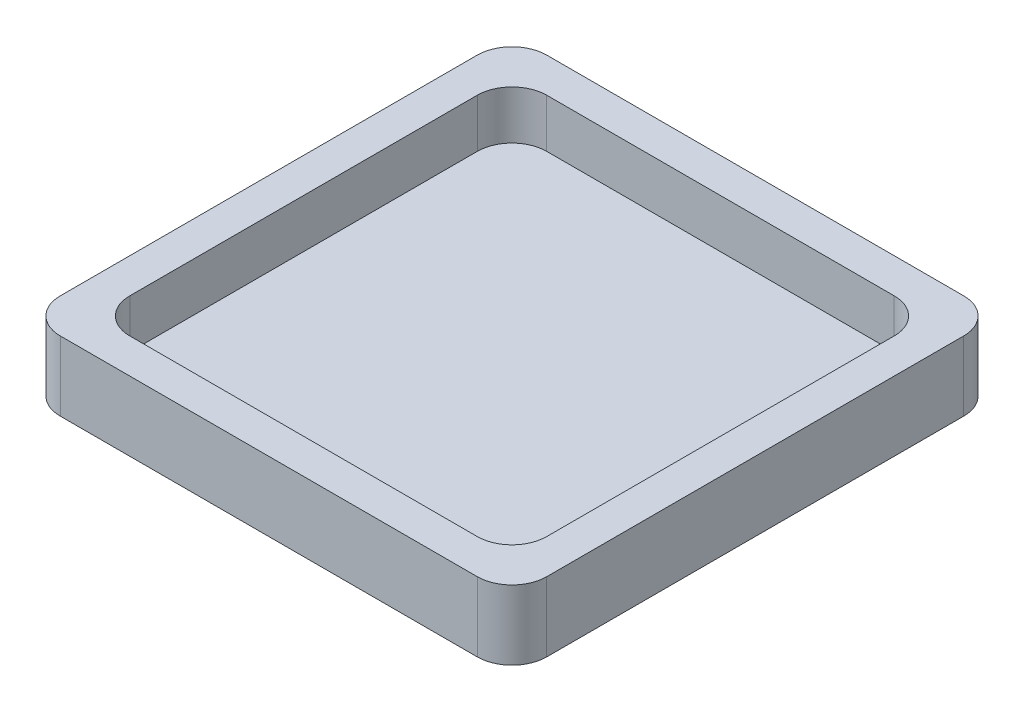
ISO-10303-21;
HEADER;
FILE_DESCRIPTION(('STEP AP214'),'2;1');
FILE_NAME('part.step','',(''),(''),'','','');
FILE_SCHEMA(('AUTOMOTIVE_DESIGN { 1 0 10303 214 1 1 1 1 }'));
ENDSEC;
DATA;
#1=APPLICATION_CONTEXT('core data for automotive mechanical design processes');
#2=APPLICATION_PROTOCOL_DEFINITION('international standard','automotive_design',2000,#1);
#3=PRODUCT_CONTEXT('',#1,'mechanical');
#4=PRODUCT('Part','Part','',(#3));
#5=PRODUCT_RELATED_PRODUCT_CATEGORY('part','',(#4));
#6=PRODUCT_DEFINITION_FORMATION('','',#4);
#7=PRODUCT_DEFINITION_CONTEXT('part definition',#1,'design');
#8=PRODUCT_DEFINITION('design','',#6,#7);
#9=PRODUCT_DEFINITION_SHAPE('','',#8);
#10=(LENGTH_UNIT() NAMED_UNIT(*) SI_UNIT(.MILLI.,.METRE.));
#11=(NAMED_UNIT(*) PLANE_ANGLE_UNIT() SI_UNIT($,.RADIAN.));
#12=(NAMED_UNIT(*) SI_UNIT($,.STERADIAN.) SOLID_ANGLE_UNIT());
#13=UNCERTAINTY_MEASURE_WITH_UNIT(LENGTH_MEASURE(1.E-05),#10,'distance_accuracy_value','');
#14=(GEOMETRIC_REPRESENTATION_CONTEXT(3) GLOBAL_UNCERTAINTY_ASSIGNED_CONTEXT((#13)) GLOBAL_UNIT_ASSIGNED_CONTEXT((#10,
#11,#12)) REPRESENTATION_CONTEXT('',''));
#15=CARTESIAN_POINT('',(0.,0.,0.));
#16=DIRECTION('',(0.,0.,1.));
#17=DIRECTION('',(1.,0.,0.));
#18=AXIS2_PLACEMENT_3D('',#15,#16,#17);
#19=CARTESIAN_POINT('',(44.45,12.7,-44.45));
#20=DIRECTION('',(-1.,0.,0.));
#21=DIRECTION('',(0.,0.,1.));
#22=AXIS2_PLACEMENT_3D('',#19,#20,#21);
#23=PLANE('',#22);
#24=DIRECTION('',(0.,0.,-1.));
#25=VECTOR('',#24,1.);
#26=CARTESIAN_POINT('',(44.45,0.,-44.45));
#27=LINE('',#26,#25);
#28=CARTESIAN_POINT('',(44.45,0.,38.1));
#29=VERTEX_POINT('',#28);
#30=CARTESIAN_POINT('',(44.45,0.,-38.1));
#31=VERTEX_POINT('',#30);
#32=EDGE_CURVE('E169',#29,#31,#27,.T.);
#33=ORIENTED_EDGE('',*,*,#32,.T.);
#34=DIRECTION('',(0.,-1.,0.));
#35=VECTOR('',#34,1.);
#36=CARTESIAN_POINT('',(44.45,12.7,-38.1));
#37=LINE('',#36,#35);
#38=CARTESIAN_POINT('',(44.45,12.7,-38.1));
#39=VERTEX_POINT('',#38);
#40=EDGE_CURVE('E204',#31,#39,#37,.F.);
#41=ORIENTED_EDGE('',*,*,#40,.T.);
#42=DIRECTION('',(0.,0.,-1.));
#43=VECTOR('',#42,1.);
#44=CARTESIAN_POINT('',(44.45,12.7,-44.45));
#45=LINE('',#44,#43);
#46=CARTESIAN_POINT('',(44.45,12.7,38.1));
#47=VERTEX_POINT('',#46);
#48=EDGE_CURVE('E167',#47,#39,#45,.T.);
#49=ORIENTED_EDGE('',*,*,#48,.F.);
#50=DIRECTION('',(0.,-1.,0.));
#51=VECTOR('',#50,1.);
#52=CARTESIAN_POINT('',(44.45,12.7,38.1));
#53=LINE('',#52,#51);
#54=EDGE_CURVE('E200',#47,#29,#53,.T.);
#55=ORIENTED_EDGE('',*,*,#54,.T.);
#56=EDGE_LOOP('',(#33,#41,#49,#55));
#57=FACE_BOUND('',#56,.T.);
#58=ADVANCED_FACE('F16',(#57),#23,.F.);
#59=CARTESIAN_POINT('',(-44.45,12.7,-44.45));
#60=DIRECTION('',(0.,0.,1.));
#61=DIRECTION('',(1.,0.,0.));
#62=AXIS2_PLACEMENT_3D('',#59,#60,#61);
#63=PLANE('',#62);
#64=DIRECTION('',(-1.,0.,0.));
#65=VECTOR('',#64,1.);
#66=CARTESIAN_POINT('',(-44.45,0.,-44.45));
#67=LINE('',#66,#65);
#68=CARTESIAN_POINT('',(38.1,0.,-44.45));
#69=VERTEX_POINT('',#68);
#70=CARTESIAN_POINT('',(-38.1,0.,-44.45));
#71=VERTEX_POINT('',#70);
#72=EDGE_CURVE('E161',#69,#71,#67,.T.);
#73=ORIENTED_EDGE('',*,*,#72,.T.);
#74=DIRECTION('',(0.,-1.,0.));
#75=VECTOR('',#74,1.);
#76=CARTESIAN_POINT('',(-38.1,12.7,-44.45));
#77=LINE('',#76,#75);
#78=CARTESIAN_POINT('',(-38.1,12.7,-44.45));
#79=VERTEX_POINT('',#78);
#80=EDGE_CURVE('E136',#71,#79,#77,.F.);
#81=ORIENTED_EDGE('',*,*,#80,.T.);
#82=DIRECTION('',(-1.,0.,0.));
#83=VECTOR('',#82,1.);
#84=CARTESIAN_POINT('',(-44.45,12.7,-44.45));
#85=LINE('',#84,#83);
#86=CARTESIAN_POINT('',(38.1,12.7,-44.45));
#87=VERTEX_POINT('',#86);
#88=EDGE_CURVE('E305',#87,#79,#85,.T.);
#89=ORIENTED_EDGE('',*,*,#88,.F.);
#90=DIRECTION('',(0.,-1.,0.));
#91=VECTOR('',#90,1.);
#92=CARTESIAN_POINT('',(38.1,12.7,-44.45));
#93=LINE('',#92,#91);
#94=EDGE_CURVE('E142',#87,#69,#93,.T.);
#95=ORIENTED_EDGE('',*,*,#94,.T.);
#96=EDGE_LOOP('',(#73,#81,#89,#95));
#97=FACE_BOUND('',#96,.T.);
#98=ADVANCED_FACE('F326',(#97),#63,.F.);
#99=CARTESIAN_POINT('',(-44.45,12.7,-44.45));
#100=DIRECTION('',(1.,0.,0.));
#101=DIRECTION('',(0.,0.,-1.));
#102=AXIS2_PLACEMENT_3D('',#99,#100,#101);
#103=PLANE('',#102);
#104=DIRECTION('',(0.,0.,1.));
#105=VECTOR('',#104,1.);
#106=CARTESIAN_POINT('',(-44.45,12.7,-44.45));
#107=LINE('',#106,#105);
#108=CARTESIAN_POINT('',(-44.45,12.7,-38.1));
#109=VERTEX_POINT('',#108);
#110=CARTESIAN_POINT('',(-44.45,12.7,38.1));
#111=VERTEX_POINT('',#110);
#112=EDGE_CURVE('E152',#109,#111,#107,.T.);
#113=ORIENTED_EDGE('',*,*,#112,.F.);
#114=DIRECTION('',(0.,-1.,0.));
#115=VECTOR('',#114,1.);
#116=CARTESIAN_POINT('',(-44.45,12.7,-38.1));
#117=LINE('',#116,#115);
#118=CARTESIAN_POINT('',(-44.45,0.,-38.1));
#119=VERTEX_POINT('',#118);
#120=EDGE_CURVE('E135',#109,#119,#117,.T.);
#121=ORIENTED_EDGE('',*,*,#120,.T.);
#122=DIRECTION('',(0.,0.,1.));
#123=VECTOR('',#122,1.);
#124=CARTESIAN_POINT('',(-44.45,0.,-44.45));
#125=LINE('',#124,#123);
#126=CARTESIAN_POINT('',(-44.45,0.,38.1));
#127=VERTEX_POINT('',#126);
#128=EDGE_CURVE('E149',#119,#127,#125,.T.);
#129=ORIENTED_EDGE('',*,*,#128,.T.);
#130=DIRECTION('',(0.,-1.,0.));
#131=VECTOR('',#130,1.);
#132=CARTESIAN_POINT('',(-44.45,12.7,38.1));
#133=LINE('',#132,#131);
#134=EDGE_CURVE('E155',#127,#111,#133,.F.);
#135=ORIENTED_EDGE('',*,*,#134,.T.);
#136=EDGE_LOOP('',(#113,#121,#129,#135));
#137=FACE_BOUND('',#136,.T.);
#138=ADVANCED_FACE('F148',(#137),#103,.F.);
#139=CARTESIAN_POINT('',(-44.45,12.7,44.45));
#140=DIRECTION('',(0.,0.,-1.));
#141=DIRECTION('',(-1.,0.,0.));
#142=AXIS2_PLACEMENT_3D('',#139,#140,#141);
#143=PLANE('',#142);
#144=DIRECTION('',(1.,0.,0.));
#145=VECTOR('',#144,1.);
#146=CARTESIAN_POINT('',(-44.45,0.,44.45));
#147=LINE('',#146,#145);
#148=CARTESIAN_POINT('',(-38.1,0.,44.45));
#149=VERTEX_POINT('',#148);
#150=CARTESIAN_POINT('',(38.1,0.,44.45));
#151=VERTEX_POINT('',#150);
#152=EDGE_CURVE('E160',#149,#151,#147,.T.);
#153=ORIENTED_EDGE('',*,*,#152,.T.);
#154=DIRECTION('',(0.,-1.,0.));
#155=VECTOR('',#154,1.);
#156=CARTESIAN_POINT('',(38.1,12.7,44.45));
#157=LINE('',#156,#155);
#158=CARTESIAN_POINT('',(38.1,12.7,44.45));
#159=VERTEX_POINT('',#158);
#160=EDGE_CURVE('E211',#151,#159,#157,.F.);
#161=ORIENTED_EDGE('',*,*,#160,.T.);
#162=DIRECTION('',(1.,0.,0.));
#163=VECTOR('',#162,1.);
#164=CARTESIAN_POINT('',(-44.45,12.7,44.45));
#165=LINE('',#164,#163);
#166=CARTESIAN_POINT('',(-38.1,12.7,44.45));
#167=VERTEX_POINT('',#166);
#168=EDGE_CURVE('E174',#167,#159,#165,.T.);
#169=ORIENTED_EDGE('',*,*,#168,.F.);
#170=DIRECTION('',(0.,-1.,0.));
#171=VECTOR('',#170,1.);
#172=CARTESIAN_POINT('',(-38.1,12.7,44.45));
#173=LINE('',#172,#171);
#174=EDGE_CURVE('E207',#167,#149,#173,.T.);
#175=ORIENTED_EDGE('',*,*,#174,.T.);
#176=EDGE_LOOP('',(#153,#161,#169,#175));
#177=FACE_BOUND('',#176,.T.);
#178=ADVANCED_FACE('F335',(#177),#143,.F.);
#179=CARTESIAN_POINT('',(0.,12.7,0.));
#180=DIRECTION('',(0.,1.,0.));
#181=DIRECTION('',(0.,0.,1.));
#182=AXIS2_PLACEMENT_3D('',#179,#180,#181);
#183=PLANE('',#182);
#184=DIRECTION('',(0.,0.,-1.));
#185=VECTOR('',#184,1.);
#186=CARTESIAN_POINT('',(38.1,12.7,-38.1));
#187=LINE('',#186,#185);
#188=CARTESIAN_POINT('',(38.1,12.7,31.75));
#189=VERTEX_POINT('',#188);
#190=CARTESIAN_POINT('',(38.1,12.7,-31.75));
#191=VERTEX_POINT('',#190);
#192=EDGE_CURVE('E275',#189,#191,#187,.T.);
#193=ORIENTED_EDGE('',*,*,#192,.F.);
#194=CARTESIAN_POINT('',(31.75,12.7,31.75));
#195=DIRECTION('',(0.,1.,0.));
#196=DIRECTION('',(0.,0.,1.));
#197=AXIS2_PLACEMENT_3D('',#194,#195,#196);
#198=CIRCLE('',#197,6.35);
#199=CARTESIAN_POINT('',(31.75,12.7,38.1));
#200=VERTEX_POINT('',#199);
#201=EDGE_CURVE('E252',#189,#200,#198,.F.);
#202=ORIENTED_EDGE('',*,*,#201,.T.);
#203=DIRECTION('',(1.,0.,0.));
#204=VECTOR('',#203,1.);
#205=CARTESIAN_POINT('',(-38.1,12.7,38.1));
#206=LINE('',#205,#204);
#207=CARTESIAN_POINT('',(-31.75,12.7,38.1));
#208=VERTEX_POINT('',#207);
#209=EDGE_CURVE('E298',#208,#200,#206,.T.);
#210=ORIENTED_EDGE('',*,*,#209,.F.);
#211=CARTESIAN_POINT('',(-31.75,12.7,31.75));
#212=DIRECTION('',(0.,1.,0.));
#213=DIRECTION('',(0.,0.,1.));
#214=AXIS2_PLACEMENT_3D('',#211,#212,#213);
#215=CIRCLE('',#214,6.35);
#216=CARTESIAN_POINT('',(-38.1,12.7,31.75));
#217=VERTEX_POINT('',#216);
#218=EDGE_CURVE('E10',#208,#217,#215,.F.);
#219=ORIENTED_EDGE('',*,*,#218,.T.);
#220=DIRECTION('',(0.,0.,1.));
#221=VECTOR('',#220,1.);
#222=CARTESIAN_POINT('',(-38.1,12.7,-38.1));
#223=LINE('',#222,#221);
#224=CARTESIAN_POINT('',(-38.1,12.7,-31.75));
#225=VERTEX_POINT('',#224);
#226=EDGE_CURVE('E266',#225,#217,#223,.T.);
#227=ORIENTED_EDGE('',*,*,#226,.F.);
#228=CARTESIAN_POINT('',(-31.75,12.7,-31.75));
#229=DIRECTION('',(0.,1.,0.));
#230=DIRECTION('',(0.,0.,1.));
#231=AXIS2_PLACEMENT_3D('',#228,#229,#230);
#232=CIRCLE('',#231,6.35);
#233=CARTESIAN_POINT('',(-31.75,12.7,-38.1));
#234=VERTEX_POINT('',#233);
#235=EDGE_CURVE('E25',#225,#234,#232,.F.);
#236=ORIENTED_EDGE('',*,*,#235,.T.);
#237=DIRECTION('',(-1.,0.,0.));
#238=VECTOR('',#237,1.);
#239=CARTESIAN_POINT('',(-38.1,12.7,-38.1));
#240=LINE('',#239,#238);
#241=CARTESIAN_POINT('',(31.75,12.7,-38.1));
#242=VERTEX_POINT('',#241);
#243=EDGE_CURVE('E265',#242,#234,#240,.T.);
#244=ORIENTED_EDGE('',*,*,#243,.F.);
#245=CARTESIAN_POINT('',(31.75,12.7,-31.75));
#246=DIRECTION('',(0.,1.,0.));
#247=DIRECTION('',(0.,0.,1.));
#248=AXIS2_PLACEMENT_3D('',#245,#246,#247);
#249=CIRCLE('',#248,6.35);
#250=EDGE_CURVE('E255',#242,#191,#249,.F.);
#251=ORIENTED_EDGE('',*,*,#250,.T.);
#252=EDGE_LOOP('',(#193,#202,#210,#219,#227,#236,#244,#251));
#253=FACE_BOUND('',#252,.T.);
#254=ORIENTED_EDGE('',*,*,#88,.T.);
#255=CARTESIAN_POINT('',(-38.1,12.7,-38.1));
#256=DIRECTION('',(0.,1.,0.));
#257=DIRECTION('',(0.,0.,1.));
#258=AXIS2_PLACEMENT_3D('',#255,#256,#257);
#259=CIRCLE('',#258,6.35);
#260=EDGE_CURVE('E197',#79,#109,#259,.T.);
#261=ORIENTED_EDGE('',*,*,#260,.T.);
#262=ORIENTED_EDGE('',*,*,#112,.T.);
#263=CARTESIAN_POINT('',(-38.1,12.7,38.1));
#264=DIRECTION('',(0.,1.,0.));
#265=DIRECTION('',(0.,0.,1.));
#266=AXIS2_PLACEMENT_3D('',#263,#264,#265);
#267=CIRCLE('',#266,6.35);
#268=EDGE_CURVE('E188',#111,#167,#267,.T.);
#269=ORIENTED_EDGE('',*,*,#268,.T.);
#270=ORIENTED_EDGE('',*,*,#168,.T.);
#271=CARTESIAN_POINT('',(38.1,12.7,38.1));
#272=DIRECTION('',(0.,1.,0.));
#273=DIRECTION('',(0.,0.,1.));
#274=AXIS2_PLACEMENT_3D('',#271,#272,#273);
#275=CIRCLE('',#274,6.35);
#276=EDGE_CURVE('E191',#159,#47,#275,.T.);
#277=ORIENTED_EDGE('',*,*,#276,.T.);
#278=ORIENTED_EDGE('',*,*,#48,.T.);
#279=CARTESIAN_POINT('',(38.1,12.7,-38.1));
#280=DIRECTION('',(0.,1.,0.));
#281=DIRECTION('',(0.,0.,1.));
#282=AXIS2_PLACEMENT_3D('',#279,#280,#281);
#283=CIRCLE('',#282,6.35);
#284=EDGE_CURVE('E194',#39,#87,#283,.T.);
#285=ORIENTED_EDGE('',*,*,#284,.T.);
#286=EDGE_LOOP('',(#254,#261,#262,#269,#270,#277,#278,#285));
#287=FACE_BOUND('',#286,.T.);
#288=ADVANCED_FACE('F263',(#253,#287),#183,.T.);
#289=CARTESIAN_POINT('',(0.,0.,0.));
#290=DIRECTION('',(0.,1.,0.));
#291=DIRECTION('',(0.,0.,1.));
#292=AXIS2_PLACEMENT_3D('',#289,#290,#291);
#293=PLANE('',#292);
#294=ORIENTED_EDGE('',*,*,#128,.F.);
#295=CARTESIAN_POINT('',(-38.1,0.,-38.1));
#296=DIRECTION('',(0.,1.,0.));
#297=DIRECTION('',(0.,0.,1.));
#298=AXIS2_PLACEMENT_3D('',#295,#296,#297);
#299=CIRCLE('',#298,6.35);
#300=EDGE_CURVE('E131',#119,#71,#299,.F.);
#301=ORIENTED_EDGE('',*,*,#300,.T.);
#302=ORIENTED_EDGE('',*,*,#72,.F.);
#303=CARTESIAN_POINT('',(38.1,0.,-38.1));
#304=DIRECTION('',(0.,1.,0.));
#305=DIRECTION('',(0.,0.,1.));
#306=AXIS2_PLACEMENT_3D('',#303,#304,#305);
#307=CIRCLE('',#306,6.35);
#308=EDGE_CURVE('E143',#69,#31,#307,.F.);
#309=ORIENTED_EDGE('',*,*,#308,.T.);
#310=ORIENTED_EDGE('',*,*,#32,.F.);
#311=CARTESIAN_POINT('',(38.1,0.,38.1));
#312=DIRECTION('',(0.,1.,0.));
#313=DIRECTION('',(0.,0.,1.));
#314=AXIS2_PLACEMENT_3D('',#311,#312,#313);
#315=CIRCLE('',#314,6.35);
#316=EDGE_CURVE('E178',#29,#151,#315,.F.);
#317=ORIENTED_EDGE('',*,*,#316,.T.);
#318=ORIENTED_EDGE('',*,*,#152,.F.);
#319=CARTESIAN_POINT('',(-38.1,0.,38.1));
#320=DIRECTION('',(0.,1.,0.));
#321=DIRECTION('',(0.,0.,1.));
#322=AXIS2_PLACEMENT_3D('',#319,#320,#321);
#323=CIRCLE('',#322,6.35);
#324=EDGE_CURVE('E154',#149,#127,#323,.F.);
#325=ORIENTED_EDGE('',*,*,#324,.T.);
#326=EDGE_LOOP('',(#294,#301,#302,#309,#310,#317,#318,#325));
#327=FACE_BOUND('',#326,.T.);
#328=ADVANCED_FACE('F157',(#327),#293,.F.);
#329=CARTESIAN_POINT('',(38.1,3.81,-38.1));
#330=DIRECTION('',(1.,0.,0.));
#331=DIRECTION('',(0.,0.,-1.));
#332=AXIS2_PLACEMENT_3D('',#329,#330,#331);
#333=PLANE('',#332);
#334=DIRECTION('',(0.,0.,-1.));
#335=VECTOR('',#334,1.);
#336=CARTESIAN_POINT('',(38.1,3.81,-38.1));
#337=LINE('',#336,#335);
#338=CARTESIAN_POINT('',(38.1,3.81,31.75));
#339=VERTEX_POINT('',#338);
#340=CARTESIAN_POINT('',(38.1,3.81,-31.75));
#341=VERTEX_POINT('',#340);
#342=EDGE_CURVE('E289',#339,#341,#337,.T.);
#343=ORIENTED_EDGE('',*,*,#342,.F.);
#344=DIRECTION('',(0.,1.,0.));
#345=VECTOR('',#344,1.);
#346=CARTESIAN_POINT('',(38.1,12.7,31.75));
#347=LINE('',#346,#345);
#348=EDGE_CURVE('E217',#339,#189,#347,.T.);
#349=ORIENTED_EDGE('',*,*,#348,.T.);
#350=ORIENTED_EDGE('',*,*,#192,.T.);
#351=DIRECTION('',(0.,1.,0.));
#352=VECTOR('',#351,1.);
#353=CARTESIAN_POINT('',(38.1,3.81,-31.75));
#354=LINE('',#353,#352);
#355=EDGE_CURVE('E214',#191,#341,#354,.F.);
#356=ORIENTED_EDGE('',*,*,#355,.T.);
#357=EDGE_LOOP('',(#343,#349,#350,#356));
#358=FACE_BOUND('',#357,.T.);
#359=ADVANCED_FACE('F381',(#358),#333,.F.);
#360=CARTESIAN_POINT('',(-38.1,3.81,38.1));
#361=DIRECTION('',(0.,0.,1.));
#362=DIRECTION('',(1.,0.,0.));
#363=AXIS2_PLACEMENT_3D('',#360,#361,#362);
#364=PLANE('',#363);
#365=ORIENTED_EDGE('',*,*,#209,.T.);
#366=DIRECTION('',(0.,1.,0.));
#367=VECTOR('',#366,1.);
#368=CARTESIAN_POINT('',(31.75,3.81,38.1));
#369=LINE('',#368,#367);
#370=CARTESIAN_POINT('',(31.75,3.81,38.1));
#371=VERTEX_POINT('',#370);
#372=EDGE_CURVE('E225',#200,#371,#369,.F.);
#373=ORIENTED_EDGE('',*,*,#372,.T.);
#374=DIRECTION('',(1.,0.,0.));
#375=VECTOR('',#374,1.);
#376=CARTESIAN_POINT('',(-38.1,3.81,38.1));
#377=LINE('',#376,#375);
#378=CARTESIAN_POINT('',(-31.75,3.81,38.1));
#379=VERTEX_POINT('',#378);
#380=EDGE_CURVE('E282',#379,#371,#377,.T.);
#381=ORIENTED_EDGE('',*,*,#380,.F.);
#382=DIRECTION('',(0.,1.,0.));
#383=VECTOR('',#382,1.);
#384=CARTESIAN_POINT('',(-31.75,12.7,38.1));
#385=LINE('',#384,#383);
#386=EDGE_CURVE('E221',#379,#208,#385,.T.);
#387=ORIENTED_EDGE('',*,*,#386,.T.);
#388=EDGE_LOOP('',(#365,#373,#381,#387));
#389=FACE_BOUND('',#388,.T.);
#390=ADVANCED_FACE('F373',(#389),#364,.F.);
#391=CARTESIAN_POINT('',(-38.1,3.81,-38.1));
#392=DIRECTION('',(-1.,0.,0.));
#393=DIRECTION('',(0.,0.,1.));
#394=AXIS2_PLACEMENT_3D('',#391,#392,#393);
#395=PLANE('',#394);
#396=DIRECTION('',(0.,0.,1.));
#397=VECTOR('',#396,1.);
#398=CARTESIAN_POINT('',(-38.1,3.81,-38.1));
#399=LINE('',#398,#397);
#400=CARTESIAN_POINT('',(-38.1,3.81,-31.75));
#401=VERTEX_POINT('',#400);
#402=CARTESIAN_POINT('',(-38.1,3.81,31.75));
#403=VERTEX_POINT('',#402);
#404=EDGE_CURVE('E279',#401,#403,#399,.T.);
#405=ORIENTED_EDGE('',*,*,#404,.F.);
#406=DIRECTION('',(0.,1.,0.));
#407=VECTOR('',#406,1.);
#408=CARTESIAN_POINT('',(-38.1,12.7,-31.75));
#409=LINE('',#408,#407);
#410=EDGE_CURVE('E248',#401,#225,#409,.T.);
#411=ORIENTED_EDGE('',*,*,#410,.T.);
#412=ORIENTED_EDGE('',*,*,#226,.T.);
#413=DIRECTION('',(0.,1.,0.));
#414=VECTOR('',#413,1.);
#415=CARTESIAN_POINT('',(-38.1,3.81,31.75));
#416=LINE('',#415,#414);
#417=EDGE_CURVE('E32',#217,#403,#416,.F.);
#418=ORIENTED_EDGE('',*,*,#417,.T.);
#419=EDGE_LOOP('',(#405,#411,#412,#418));
#420=FACE_BOUND('',#419,.T.);
#421=ADVANCED_FACE('F278',(#420),#395,.F.);
#422=CARTESIAN_POINT('',(-38.1,3.81,-38.1));
#423=DIRECTION('',(0.,0.,-1.));
#424=DIRECTION('',(-1.,0.,0.));
#425=AXIS2_PLACEMENT_3D('',#422,#423,#424);
#426=PLANE('',#425);
#427=DIRECTION('',(-1.,0.,0.));
#428=VECTOR('',#427,1.);
#429=CARTESIAN_POINT('',(-38.1,3.81,-38.1));
#430=LINE('',#429,#428);
#431=CARTESIAN_POINT('',(31.75,3.81,-38.1));
#432=VERTEX_POINT('',#431);
#433=CARTESIAN_POINT('',(-31.75,3.81,-38.1));
#434=VERTEX_POINT('',#433);
#435=EDGE_CURVE('E283',#432,#434,#430,.T.);
#436=ORIENTED_EDGE('',*,*,#435,.F.);
#437=DIRECTION('',(0.,1.,0.));
#438=VECTOR('',#437,1.);
#439=CARTESIAN_POINT('',(31.75,12.7,-38.1));
#440=LINE('',#439,#438);
#441=EDGE_CURVE('E242',#432,#242,#440,.T.);
#442=ORIENTED_EDGE('',*,*,#441,.T.);
#443=ORIENTED_EDGE('',*,*,#243,.T.);
#444=DIRECTION('',(0.,1.,0.));
#445=VECTOR('',#444,1.);
#446=CARTESIAN_POINT('',(-31.75,3.81,-38.1));
#447=LINE('',#446,#445);
#448=EDGE_CURVE('E239',#234,#434,#447,.F.);
#449=ORIENTED_EDGE('',*,*,#448,.T.);
#450=EDGE_LOOP('',(#436,#442,#443,#449));
#451=FACE_BOUND('',#450,.T.);
#452=ADVANCED_FACE('F272',(#451),#426,.F.);
#453=CARTESIAN_POINT('',(0.,3.81,0.));
#454=DIRECTION('',(0.,1.,0.));
#455=DIRECTION('',(0.,0.,1.));
#456=AXIS2_PLACEMENT_3D('',#453,#454,#455);
#457=PLANE('',#456);
#458=ORIENTED_EDGE('',*,*,#380,.T.);
#459=CARTESIAN_POINT('',(31.75,3.81,31.75));
#460=DIRECTION('',(0.,1.,0.));
#461=DIRECTION('',(0.,0.,1.));
#462=AXIS2_PLACEMENT_3D('',#459,#460,#461);
#463=CIRCLE('',#462,6.35);
#464=EDGE_CURVE('E236',#371,#339,#463,.T.);
#465=ORIENTED_EDGE('',*,*,#464,.T.);
#466=ORIENTED_EDGE('',*,*,#342,.T.);
#467=CARTESIAN_POINT('',(31.75,3.81,-31.75));
#468=DIRECTION('',(0.,1.,0.));
#469=DIRECTION('',(0.,0.,1.));
#470=AXIS2_PLACEMENT_3D('',#467,#468,#469);
#471=CIRCLE('',#470,6.35);
#472=EDGE_CURVE('E233',#341,#432,#471,.T.);
#473=ORIENTED_EDGE('',*,*,#472,.T.);
#474=ORIENTED_EDGE('',*,*,#435,.T.);
#475=CARTESIAN_POINT('',(-31.75,3.81,-31.75));
#476=DIRECTION('',(0.,1.,0.));
#477=DIRECTION('',(0.,0.,1.));
#478=AXIS2_PLACEMENT_3D('',#475,#476,#477);
#479=CIRCLE('',#478,6.35);
#480=EDGE_CURVE('E39',#434,#401,#479,.T.);
#481=ORIENTED_EDGE('',*,*,#480,.T.);
#482=ORIENTED_EDGE('',*,*,#404,.T.);
#483=CARTESIAN_POINT('',(-31.75,3.81,31.75));
#484=DIRECTION('',(0.,1.,0.));
#485=DIRECTION('',(0.,0.,1.));
#486=AXIS2_PLACEMENT_3D('',#483,#484,#485);
#487=CIRCLE('',#486,6.35);
#488=EDGE_CURVE('E228',#403,#379,#487,.T.);
#489=ORIENTED_EDGE('',*,*,#488,.T.);
#490=EDGE_LOOP('',(#458,#465,#466,#473,#474,#481,#482,#489));
#491=FACE_BOUND('',#490,.T.);
#492=ADVANCED_FACE('F342',(#491),#457,.T.);
#493=CARTESIAN_POINT('',(-38.1,12.7,-38.1));
#494=DIRECTION('',(0.,-1.,0.));
#495=DIRECTION('',(0.,0.,-1.));
#496=AXIS2_PLACEMENT_3D('',#493,#494,#495);
#497=CYLINDRICAL_SURFACE('',#496,6.35);
#498=ORIENTED_EDGE('',*,*,#260,.F.);
#499=ORIENTED_EDGE('',*,*,#80,.F.);
#500=ORIENTED_EDGE('',*,*,#300,.F.);
#501=ORIENTED_EDGE('',*,*,#120,.F.);
#502=EDGE_LOOP('',(#498,#499,#500,#501));
#503=FACE_BOUND('',#502,.T.);
#504=ADVANCED_FACE('F134',(#503),#497,.T.);
#505=CARTESIAN_POINT('',(38.1,12.7,-38.1));
#506=DIRECTION('',(0.,-1.,0.));
#507=DIRECTION('',(0.,0.,-1.));
#508=AXIS2_PLACEMENT_3D('',#505,#506,#507);
#509=CYLINDRICAL_SURFACE('',#508,6.35);
#510=ORIENTED_EDGE('',*,*,#284,.F.);
#511=ORIENTED_EDGE('',*,*,#40,.F.);
#512=ORIENTED_EDGE('',*,*,#308,.F.);
#513=ORIENTED_EDGE('',*,*,#94,.F.);
#514=EDGE_LOOP('',(#510,#511,#512,#513));
#515=FACE_BOUND('',#514,.T.);
#516=ADVANCED_FACE('F322',(#515),#509,.T.);
#517=CARTESIAN_POINT('',(38.1,12.7,38.1));
#518=DIRECTION('',(0.,-1.,0.));
#519=DIRECTION('',(0.,0.,-1.));
#520=AXIS2_PLACEMENT_3D('',#517,#518,#519);
#521=CYLINDRICAL_SURFACE('',#520,6.35);
#522=ORIENTED_EDGE('',*,*,#276,.F.);
#523=ORIENTED_EDGE('',*,*,#160,.F.);
#524=ORIENTED_EDGE('',*,*,#316,.F.);
#525=ORIENTED_EDGE('',*,*,#54,.F.);
#526=EDGE_LOOP('',(#522,#523,#524,#525));
#527=FACE_BOUND('',#526,.T.);
#528=ADVANCED_FACE('F345',(#527),#521,.T.);
#529=CARTESIAN_POINT('',(-38.1,12.7,38.1));
#530=DIRECTION('',(0.,-1.,0.));
#531=DIRECTION('',(0.,0.,-1.));
#532=AXIS2_PLACEMENT_3D('',#529,#530,#531);
#533=CYLINDRICAL_SURFACE('',#532,6.35);
#534=ORIENTED_EDGE('',*,*,#268,.F.);
#535=ORIENTED_EDGE('',*,*,#134,.F.);
#536=ORIENTED_EDGE('',*,*,#324,.F.);
#537=ORIENTED_EDGE('',*,*,#174,.F.);
#538=EDGE_LOOP('',(#534,#535,#536,#537));
#539=FACE_BOUND('',#538,.T.);
#540=ADVANCED_FACE('F348',(#539),#533,.T.);
#541=CARTESIAN_POINT('',(31.75,3.81,31.75));
#542=DIRECTION('',(0.,-1.,0.));
#543=DIRECTION('',(0.,0.,-1.));
#544=AXIS2_PLACEMENT_3D('',#541,#542,#543);
#545=CYLINDRICAL_SURFACE('',#544,6.35);
#546=ORIENTED_EDGE('',*,*,#464,.F.);
#547=ORIENTED_EDGE('',*,*,#372,.F.);
#548=ORIENTED_EDGE('',*,*,#201,.F.);
#549=ORIENTED_EDGE('',*,*,#348,.F.);
#550=EDGE_LOOP('',(#546,#547,#548,#549));
#551=FACE_BOUND('',#550,.T.);
#552=ADVANCED_FACE('F352',(#551),#545,.F.);
#553=CARTESIAN_POINT('',(31.75,3.81,-31.75));
#554=DIRECTION('',(0.,-1.,0.));
#555=DIRECTION('',(0.,0.,-1.));
#556=AXIS2_PLACEMENT_3D('',#553,#554,#555);
#557=CYLINDRICAL_SURFACE('',#556,6.35);
#558=ORIENTED_EDGE('',*,*,#472,.F.);
#559=ORIENTED_EDGE('',*,*,#355,.F.);
#560=ORIENTED_EDGE('',*,*,#250,.F.);
#561=ORIENTED_EDGE('',*,*,#441,.F.);
#562=EDGE_LOOP('',(#558,#559,#560,#561));
#563=FACE_BOUND('',#562,.T.);
#564=ADVANCED_FACE('F356',(#563),#557,.F.);
#565=CARTESIAN_POINT('',(-31.75,3.81,-31.75));
#566=DIRECTION('',(0.,-1.,0.));
#567=DIRECTION('',(0.,0.,-1.));
#568=AXIS2_PLACEMENT_3D('',#565,#566,#567);
#569=CYLINDRICAL_SURFACE('',#568,6.35);
#570=ORIENTED_EDGE('',*,*,#480,.F.);
#571=ORIENTED_EDGE('',*,*,#448,.F.);
#572=ORIENTED_EDGE('',*,*,#235,.F.);
#573=ORIENTED_EDGE('',*,*,#410,.F.);
#574=EDGE_LOOP('',(#570,#571,#572,#573));
#575=FACE_BOUND('',#574,.T.);
#576=ADVANCED_FACE('F277',(#575),#569,.F.);
#577=CARTESIAN_POINT('',(-31.75,3.81,31.75));
#578=DIRECTION('',(0.,-1.,0.));
#579=DIRECTION('',(0.,0.,-1.));
#580=AXIS2_PLACEMENT_3D('',#577,#578,#579);
#581=CYLINDRICAL_SURFACE('',#580,6.35);
#582=ORIENTED_EDGE('',*,*,#488,.F.);
#583=ORIENTED_EDGE('',*,*,#417,.F.);
#584=ORIENTED_EDGE('',*,*,#218,.F.);
#585=ORIENTED_EDGE('',*,*,#386,.F.);
#586=EDGE_LOOP('',(#582,#583,#584,#585));
#587=FACE_BOUND('',#586,.T.);
#588=ADVANCED_FACE('F18',(#587),#581,.F.);
#589=CLOSED_SHELL('',(#58,#98,#138,#178,#288,#328,#359,#390,#421,#452,#492,#504,#516,#528,#540,
#552,#564,#576,#588));
#590=MANIFOLD_SOLID_BREP('B1',#589);
#591=ADVANCED_BREP_SHAPE_REPRESENTATION('',(#18,#590),#14);
#592=SHAPE_DEFINITION_REPRESENTATION(#9,#591);
ENDSEC;
END-ISO-10303-21;
